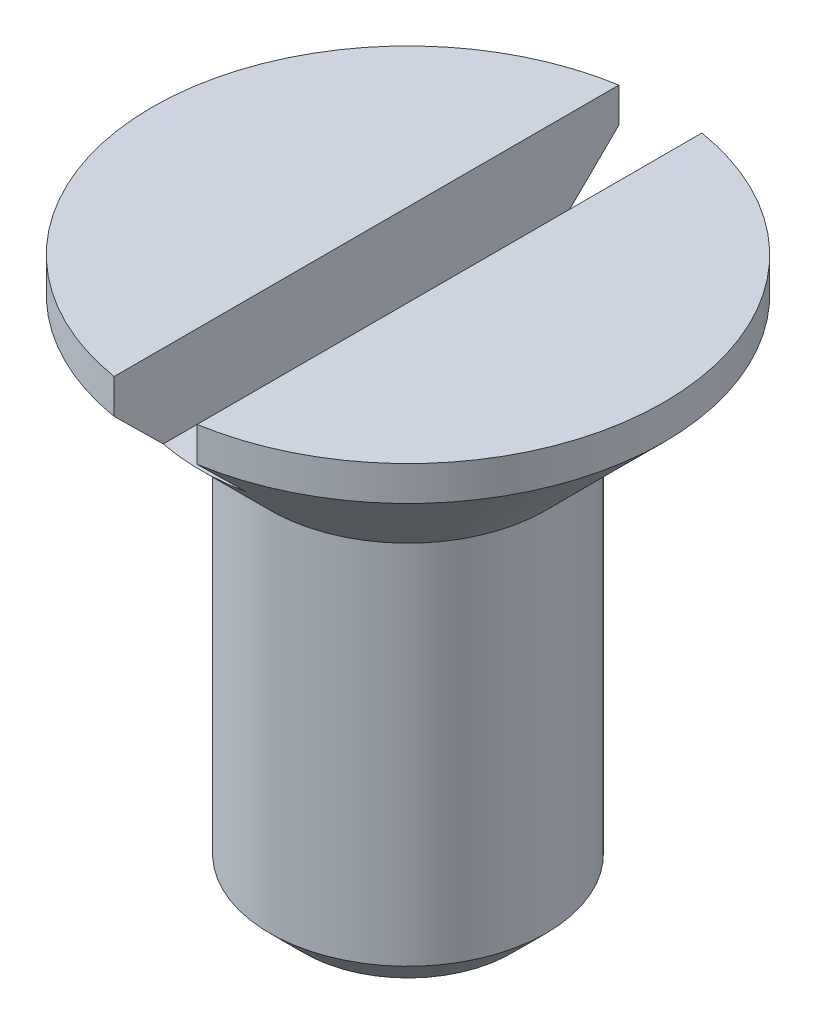
ISO-10303-21;
HEADER;
FILE_DESCRIPTION(('STEP AP214'),'2;1');
FILE_NAME('part.step','',(''),(''),'','','');
FILE_SCHEMA(('AUTOMOTIVE_DESIGN { 1 0 10303 214 1 1 1 1 }'));
ENDSEC;
DATA;
#1=APPLICATION_CONTEXT('core data for automotive mechanical design processes');
#2=APPLICATION_PROTOCOL_DEFINITION('international standard','automotive_design',2000,#1);
#3=PRODUCT_CONTEXT('',#1,'mechanical');
#4=PRODUCT('Part','Part','',(#3));
#5=PRODUCT_RELATED_PRODUCT_CATEGORY('part','',(#4));
#6=PRODUCT_DEFINITION_FORMATION('','',#4);
#7=PRODUCT_DEFINITION_CONTEXT('part definition',#1,'design');
#8=PRODUCT_DEFINITION('design','',#6,#7);
#9=PRODUCT_DEFINITION_SHAPE('','',#8);
#10=(LENGTH_UNIT() NAMED_UNIT(*) SI_UNIT(.MILLI.,.METRE.));
#11=(NAMED_UNIT(*) PLANE_ANGLE_UNIT() SI_UNIT($,.RADIAN.));
#12=(NAMED_UNIT(*) SI_UNIT($,.STERADIAN.) SOLID_ANGLE_UNIT());
#13=UNCERTAINTY_MEASURE_WITH_UNIT(LENGTH_MEASURE(1.E-05),#10,'distance_accuracy_value','');
#14=(GEOMETRIC_REPRESENTATION_CONTEXT(3) GLOBAL_UNCERTAINTY_ASSIGNED_CONTEXT((#13)) GLOBAL_UNIT_ASSIGNED_CONTEXT((#10,
#11,#12)) REPRESENTATION_CONTEXT('',''));
#15=CARTESIAN_POINT('',(0.,0.,0.));
#16=DIRECTION('',(0.,0.,1.));
#17=DIRECTION('',(1.,0.,0.));
#18=AXIS2_PLACEMENT_3D('',#15,#16,#17);
#19=CARTESIAN_POINT('',(-3.7,8.,0.));
#20=DIRECTION('',(0.,1.,0.));
#21=DIRECTION('',(-1.,0.,0.));
#22=AXIS2_PLACEMENT_3D('',#19,#20,#21);
#23=PLANE('',#22);
#24=DIRECTION('',(0.,0.,1.));
#25=VECTOR('',#24,1.);
#26=CARTESIAN_POINT('',(-0.6,8.,-3.7));
#27=LINE('',#26,#25);
#28=CARTESIAN_POINT('',(-0.6,8.,-3.65102725270574));
#29=VERTEX_POINT('',#28);
#30=CARTESIAN_POINT('',(-0.6,8.,3.65102725270574));
#31=VERTEX_POINT('',#30);
#32=EDGE_CURVE('E135',#29,#31,#27,.T.);
#33=ORIENTED_EDGE('',*,*,#32,.F.);
#34=CARTESIAN_POINT('',(0.,8.,0.));
#35=DIRECTION('',(0.,1.,0.));
#36=DIRECTION('',(-1.,0.,0.));
#37=AXIS2_PLACEMENT_3D('',#34,#35,#36);
#38=CIRCLE('',#37,3.7);
#39=EDGE_CURVE('E112',#29,#31,#38,.T.);
#40=ORIENTED_EDGE('',*,*,#39,.T.);
#41=EDGE_LOOP('',(#33,#40));
#42=FACE_BOUND('',#41,.T.);
#43=ADVANCED_FACE('F28',(#42),#23,.T.);
#44=CARTESIAN_POINT('',(0.,8.,0.));
#45=DIRECTION('',(0.,1.,0.));
#46=DIRECTION('',(-1.,0.,0.));
#47=AXIS2_PLACEMENT_3D('',#44,#45,#46);
#48=CYLINDRICAL_SURFACE('',#47,3.7);
#49=DIRECTION('',(0.,1.,0.));
#50=VECTOR('',#49,1.);
#51=CARTESIAN_POINT('',(-0.6,8.,3.65102725270574));
#52=LINE('',#51,#50);
#53=CARTESIAN_POINT('',(-0.6,7.50000000000002,3.65102725270574));
#54=VERTEX_POINT('',#53);
#55=EDGE_CURVE('E56',#31,#54,#52,.F.);
#56=ORIENTED_EDGE('',*,*,#55,.F.);
#57=ORIENTED_EDGE('',*,*,#39,.F.);
#58=DIRECTION('',(0.,1.,0.));
#59=VECTOR('',#58,1.);
#60=CARTESIAN_POINT('',(-0.6,8.,-3.65102725270574));
#61=LINE('',#60,#59);
#62=CARTESIAN_POINT('',(-0.6,7.50000000000002,-3.65102725270574));
#63=VERTEX_POINT('',#62);
#64=EDGE_CURVE('E129',#63,#29,#61,.T.);
#65=ORIENTED_EDGE('',*,*,#64,.F.);
#66=CARTESIAN_POINT('',(0.,7.50000000000002,0.));
#67=DIRECTION('',(0.,1.,0.));
#68=DIRECTION('',(-1.,0.,0.));
#69=AXIS2_PLACEMENT_3D('',#66,#67,#68);
#70=CIRCLE('',#69,3.7);
#71=EDGE_CURVE('E116',#63,#54,#70,.T.);
#72=ORIENTED_EDGE('',*,*,#71,.T.);
#73=EDGE_LOOP('',(#56,#57,#65,#72));
#74=FACE_BOUND('',#73,.T.);
#75=ADVANCED_FACE('F145',(#74),#48,.T.);
#76=DIRECTION('',(0.,0.,1.));
#77=VECTOR('',#76,1.);
#78=CARTESIAN_POINT('',(0.6,8.,-3.7));
#79=LINE('',#78,#77);
#80=CARTESIAN_POINT('',(0.6,8.,-3.65102725270574));
#81=VERTEX_POINT('',#80);
#82=CARTESIAN_POINT('',(0.6,8.,3.65102725270574));
#83=VERTEX_POINT('',#82);
#84=EDGE_CURVE('E99',#81,#83,#79,.T.);
#85=ORIENTED_EDGE('',*,*,#84,.T.);
#86=EDGE_CURVE('E110',#83,#81,#38,.T.);
#87=ORIENTED_EDGE('',*,*,#86,.T.);
#88=EDGE_LOOP('',(#85,#87));
#89=FACE_BOUND('',#88,.T.);
#90=ADVANCED_FACE('F30',(#89),#23,.T.);
#91=DIRECTION('',(0.,1.,0.));
#92=VECTOR('',#91,1.);
#93=CARTESIAN_POINT('',(0.6,8.,-3.65102725270574));
#94=LINE('',#93,#92);
#95=CARTESIAN_POINT('',(0.6,7.50000000000002,-3.65102725270574));
#96=VERTEX_POINT('',#95);
#97=EDGE_CURVE('E131',#81,#96,#94,.F.);
#98=ORIENTED_EDGE('',*,*,#97,.F.);
#99=ORIENTED_EDGE('',*,*,#86,.F.);
#100=DIRECTION('',(0.,1.,0.));
#101=VECTOR('',#100,1.);
#102=CARTESIAN_POINT('',(0.6,8.,3.65102725270574));
#103=LINE('',#102,#101);
#104=CARTESIAN_POINT('',(0.6,7.50000000000002,3.65102725270574));
#105=VERTEX_POINT('',#104);
#106=EDGE_CURVE('E133',#105,#83,#103,.T.);
#107=ORIENTED_EDGE('',*,*,#106,.F.);
#108=EDGE_CURVE('E105',#105,#96,#70,.T.);
#109=ORIENTED_EDGE('',*,*,#108,.T.);
#110=EDGE_LOOP('',(#98,#99,#107,#109));
#111=FACE_BOUND('',#110,.T.);
#112=ADVANCED_FACE('F152',(#111),#48,.T.);
#113=CARTESIAN_POINT('',(0.,7.50000000000002,0.));
#114=DIRECTION('',(0.,1.,0.));
#115=DIRECTION('',(-1.,0.,0.));
#116=AXIS2_PLACEMENT_3D('',#113,#114,#115);
#117=CONICAL_SURFACE('',#116,3.7,0.785398163397443);
#118=CARTESIAN_POINT('',(-0.6,11.9600206241956,8.13793196010485));
#119=CARTESIAN_POINT('',(-0.6,11.6768912812845,7.85402777231896));
#120=CARTESIAN_POINT('',(-0.6,11.3937960861909,7.57008950002176));
#121=CARTESIAN_POINT('',(-0.6,10.8277099701474,7.00209082271698));
#122=CARTESIAN_POINT('',(-0.6,10.5447190528461,6.71803041407335));
#123=CARTESIAN_POINT('',(-0.6,9.97868260725446,6.14953775036886));
#124=CARTESIAN_POINT('',(-0.6,9.69563719837715,5.865105376384));
#125=CARTESIAN_POINT('',(-0.6,9.12979934399216,5.29600682483285));
#126=CARTESIAN_POINT('',(-0.6,8.84700689083491,5.011340654873));
#127=CARTESIAN_POINT('',(-0.6,8.28573332583054,4.44556875001047));
#128=CARTESIAN_POINT('',(-0.6,8.0072468080645,4.16446838236596));
#129=CARTESIAN_POINT('',(-0.6,7.59002402076898,3.74228982182657));
#130=CARTESIAN_POINT('',(-0.6,7.45102756858926,3.60146883259403));
#131=CARTESIAN_POINT('',(-0.6,7.17328458074779,3.31958319518965));
#132=CARTESIAN_POINT('',(-0.6,7.03453804271779,3.17851854935183));
#133=CARTESIAN_POINT('',(-0.6,6.7574716483417,2.89609946410978));
#134=CARTESIAN_POINT('',(-0.6,6.61915162325729,2.75474519043095));
#135=CARTESIAN_POINT('',(-0.6,6.34307152650493,2.47148070482768));
#136=CARTESIAN_POINT('',(-0.6,6.20531147549013,2.32957047277055));
#137=CARTESIAN_POINT('',(-0.6,5.93074167412053,2.04487556787213));
#138=CARTESIAN_POINT('',(-0.6,5.79393176803235,1.9020910459126));
#139=CARTESIAN_POINT('',(-0.6,5.59005283805898,1.68665676476746));
#140=CARTESIAN_POINT('',(-0.6,5.52231783944741,1.61463791010643));
#141=CARTESIAN_POINT('',(-0.6,5.38750438125967,1.4699889932015));
#142=CARTESIAN_POINT('',(-0.6,5.3204259074044,1.39735894431496));
#143=CARTESIAN_POINT('',(-0.6,5.21737067452687,1.28421539613837));
#144=CARTESIAN_POINT('',(-0.6,5.18104052020518,1.24402402952271));
#145=CARTESIAN_POINT('',(-0.6,5.10877701321241,1.16328117926467));
#146=CARTESIAN_POINT('',(-0.6,5.07284368408855,1.12272967450692));
#147=CARTESIAN_POINT('',(-0.6,5.0013920679676,1.04102691374381));
#148=CARTESIAN_POINT('',(-0.6,4.96587552547039,0.99987412858094));
#149=CARTESIAN_POINT('',(-0.6,4.89558487643355,0.916946976871493));
#150=CARTESIAN_POINT('',(-0.6,4.86081066138162,0.875172702709308));
#151=CARTESIAN_POINT('',(-0.6,4.79510737046944,0.794199307952508));
#152=CARTESIAN_POINT('',(-0.6,4.76409575648193,0.755067466057448));
#153=CARTESIAN_POINT('',(-0.6,4.70336797523996,0.675813657835008));
#154=CARTESIAN_POINT('',(-0.6,4.67365157281672,0.635691873338648));
#155=CARTESIAN_POINT('',(-0.6,4.61622665647741,0.554135181970051));
#156=CARTESIAN_POINT('',(-0.6,4.58851442849082,0.512702919788467));
#157=CARTESIAN_POINT('',(-0.6,4.53621522205618,0.42793542507467));
#158=CARTESIAN_POINT('',(-0.6,4.51162392023787,0.384602939456319));
#159=CARTESIAN_POINT('',(-0.6,4.47077124344621,0.301726491885901));
#160=CARTESIAN_POINT('',(-0.6,4.45382070718996,0.262532602955207));
#161=CARTESIAN_POINT('',(-0.6,4.42590828603837,0.182109312015812));
#162=CARTESIAN_POINT('',(-0.6,4.41492295078954,0.140888585704839));
#163=CARTESIAN_POINT('',(-0.6,4.402410068702,0.0639247858075778));
#164=CARTESIAN_POINT('',(-0.6,4.39962349148701,0.0283967599025282));
#165=CARTESIAN_POINT('',(-0.6,4.40046012470945,-0.0425631065150474));
#166=CARTESIAN_POINT('',(-0.6,4.40408119868653,-0.077994975143782));
#167=CARTESIAN_POINT('',(-0.6,4.4191108613007,-0.159349986954465));
#168=CARTESIAN_POINT('',(-0.6,4.43270391393231,-0.204855293705314));
#169=CARTESIAN_POINT('',(-0.6,4.4581067891676,-0.271162915462734));
#170=CARTESIAN_POINT('',(-0.6,4.46744883758506,-0.293008638455442));
#171=CARTESIAN_POINT('',(-0.6,4.48745397120612,-0.336087239478985));
#172=CARTESIAN_POINT('',(-0.6,4.49811672299072,-0.357320270525163));
#173=CARTESIAN_POINT('',(-0.6,4.52939555581037,-0.415982831640739));
#174=CARTESIAN_POINT('',(-0.6,4.55115624380446,-0.452795694277315));
#175=CARTESIAN_POINT('',(-0.6,4.59682208128606,-0.525077964984184));
#176=CARTESIAN_POINT('',(-0.6,4.62072901479264,-0.560546219893626));
#177=CARTESIAN_POINT('',(-0.6,4.67004195715454,-0.630548437000616));
#178=CARTESIAN_POINT('',(-0.6,4.69545152537907,-0.665079873092603));
#179=CARTESIAN_POINT('',(-0.6,4.74728510442057,-0.733375806005275));
#180=CARTESIAN_POINT('',(-0.6,4.77370928127676,-0.767140175845283));
#181=CARTESIAN_POINT('',(-0.6,4.85434134965783,-0.86791924414059));
#182=CARTESIAN_POINT('',(-0.6,4.90964257975871,-0.934056109051676));
#183=CARTESIAN_POINT('',(-0.6,5.02176654130162,-1.06481071116444));
#184=CARTESIAN_POINT('',(-0.6,5.07858650349831,-1.12943085704488));
#185=CARTESIAN_POINT('',(-0.6,5.19241187106198,-1.25682824367005));
#186=CARTESIAN_POINT('',(-0.6,5.24940259970984,-1.31961861941936));
#187=CARTESIAN_POINT('',(-0.6,5.36404478846877,-1.44459287058122));
#188=CARTESIAN_POINT('',(-0.6,5.42169625897604,-1.50677673642228));
#189=CARTESIAN_POINT('',(-0.6,5.59534223900285,-1.69270278432733));
#190=CARTESIAN_POINT('',(-0.6,5.71201793375946,-1.81580796723869));
#191=CARTESIAN_POINT('',(-0.6,5.94644280759327,-2.0611887484764));
#192=CARTESIAN_POINT('',(-0.6,6.06419282008438,-2.18346354647024));
#193=CARTESIAN_POINT('',(-0.6,6.30028890308813,-2.42742423040908));
#194=CARTESIAN_POINT('',(-0.6,6.41863494334992,-2.5491101456397));
#195=CARTESIAN_POINT('',(-0.6,6.65500717812537,-2.79137280615527));
#196=CARTESIAN_POINT('',(-0.6,6.77303104136325,-2.91195182898463));
#197=CARTESIAN_POINT('',(-0.6,7.00934781550322,-3.15284893689327));
#198=CARTESIAN_POINT('',(-0.6,7.127640729892,-3.27316701855105));
#199=CARTESIAN_POINT('',(-0.6,7.48272713697432,-3.63376526150934));
#200=CARTESIAN_POINT('',(-0.6,7.7198037469924,-3.87376652863277));
#201=CARTESIAN_POINT('',(-0.6,8.28863195924055,-4.44861133790147));
#202=CARTESIAN_POINT('',(-0.6,8.62058203399428,-4.78325830289931));
#203=CARTESIAN_POINT('',(-0.6,9.28494781383582,-5.45216769917099));
#204=CARTESIAN_POINT('',(-0.6,9.61736356911085,-5.78643008057179));
#205=CARTESIAN_POINT('',(-0.6,10.2847457930006,-6.45701285565821));
#206=CARTESIAN_POINT('',(-0.6,10.6197140122828,-6.79333150662994));
#207=CARTESIAN_POINT('',(-0.6,11.2897808105559,-7.46575829971184));
#208=CARTESIAN_POINT('',(-0.6,11.6248793690147,-7.80186646228028));
#209=CARTESIAN_POINT('',(-0.6,11.9600206241956,-8.13793196010485));
#210=B_SPLINE_CURVE_WITH_KNOTS('',3,(#118,#119,#120,#121,#122,#123,#124,#125,#126,#127,#128,
#129,#130,#131,#132,#133,#134,#135,#136,#137,#138,#139,#140,#141,#142,#143,#144,#145,#146,#147,
#148,#149,#150,#151,#152,#153,#154,#155,#156,#157,#158,#159,#160,#161,#162,#163,#164,#165,#166,
#167,#168,#169,#170,#171,#172,#173,#174,#175,#176,#177,#178,#179,#180,#181,#182,#183,#184,#185,
#186,#187,#188,#189,#190,#191,#192,#193,#194,#195,#196,#197,#198,#199,#200,#201,#202,#203,#204,
#205,#206,#207,#208,#209),.UNSPECIFIED.,.F.,.F.,(4,2,2,2,2,2,2,2,2,2,2,2,2,2,2,2,2,2,2,2,2,2,2,
2,2,2,2,2,2,2,2,2,2,2,2,2,2,2,2,2,2,2,2,2,2,4),(0.,1.20286091475452,2.40576053584868,
3.60956618842961,4.81333411531859,6.00040930817249,6.59400413473686,7.18759330634946,
7.78090579697013,8.3742399753186,8.96747449255334,9.26407415171825,9.5606673455807,
9.72319861560583,9.88573947880689,10.0488126207255,10.2118617593269,10.3616347814149,
10.5113804952798,10.6608411897885,10.8100925247216,10.9379019301194,11.0652051861339,
11.1715563779878,11.2778721165554,11.4194479223042,11.4907036241509,11.5619413736212,
11.6901080531411,11.8183822726337,11.9469735623142,12.075585986218,12.3341618029343,
12.5922945826552,12.8466786122314,13.1010666498339,13.6098890890932,14.1191470825747,
14.6283794844877,15.1345611743107,15.6407494616195,16.6528023877671,18.0668791450929,
19.4811222704145,20.9051395740233,22.3289855542461),.UNSPECIFIED.);
#211=CARTESIAN_POINT('',(-0.6,6.8,2.9393876913398));
#212=VERTEX_POINT('',#211);
#213=EDGE_CURVE('E11',#54,#212,#210,.T.);
#214=ORIENTED_EDGE('',*,*,#213,.F.);
#215=ORIENTED_EDGE('',*,*,#71,.F.);
#216=CARTESIAN_POINT('',(-0.6,6.8,-2.9393876913398));
#217=VERTEX_POINT('',#216);
#218=EDGE_CURVE('E32',#217,#63,#210,.T.);
#219=ORIENTED_EDGE('',*,*,#218,.F.);
#220=CARTESIAN_POINT('',(0.,6.8,0.));
#221=DIRECTION('',(0.,-1.,0.));
#222=DIRECTION('',(0.,0.,-1.));
#223=AXIS2_PLACEMENT_3D('',#220,#221,#222);
#224=CIRCLE('',#223,2.99999999999999);
#225=CARTESIAN_POINT('',(0.6,6.8,-2.9393876913398));
#226=VERTEX_POINT('',#225);
#227=EDGE_CURVE('E92',#226,#217,#224,.F.);
#228=ORIENTED_EDGE('',*,*,#227,.F.);
#229=CARTESIAN_POINT('',(0.6,11.9600206241956,-8.13793196010485));
#230=CARTESIAN_POINT('',(0.6,11.6768912812845,-7.85402777231896));
#231=CARTESIAN_POINT('',(0.6,11.3937960861909,-7.57008950002176));
#232=CARTESIAN_POINT('',(0.6,10.8277099701474,-7.00209082271698));
#233=CARTESIAN_POINT('',(0.6,10.5447190528461,-6.71803041407335));
#234=CARTESIAN_POINT('',(0.6,9.97868260725446,-6.14953775036886));
#235=CARTESIAN_POINT('',(0.6,9.69563719837715,-5.865105376384));
#236=CARTESIAN_POINT('',(0.6,9.12979934399216,-5.29600682483285));
#237=CARTESIAN_POINT('',(0.6,8.84700689083492,-5.011340654873));
#238=CARTESIAN_POINT('',(0.6,8.28573332583054,-4.44556875001047));
#239=CARTESIAN_POINT('',(0.6,8.0072468080645,-4.16446838236596));
#240=CARTESIAN_POINT('',(0.6,7.59002402076898,-3.74228982182657));
#241=CARTESIAN_POINT('',(0.6,7.45102756858926,-3.60146883259403));
#242=CARTESIAN_POINT('',(0.6,7.17328458074779,-3.31958319518965));
#243=CARTESIAN_POINT('',(0.6,7.0345380427178,-3.17851854935183));
#244=CARTESIAN_POINT('',(0.6,6.7574716483417,-2.89609946410978));
#245=CARTESIAN_POINT('',(0.6,6.6191516232573,-2.75474519043096));
#246=CARTESIAN_POINT('',(0.6,6.34307152650493,-2.47148070482769));
#247=CARTESIAN_POINT('',(0.6,6.20531147549013,-2.32957047277055));
#248=CARTESIAN_POINT('',(0.6,5.93074167412053,-2.04487556787213));
#249=CARTESIAN_POINT('',(0.6,5.79393176803235,-1.90209104591261));
#250=CARTESIAN_POINT('',(0.6,5.59005283805898,-1.68665676476746));
#251=CARTESIAN_POINT('',(0.6,5.52231783944741,-1.61463791010643));
#252=CARTESIAN_POINT('',(0.6,5.38750438125967,-1.4699889932015));
#253=CARTESIAN_POINT('',(0.6,5.3204259074044,-1.39735894431496));
#254=CARTESIAN_POINT('',(0.6,5.21737067452687,-1.28421539613837));
#255=CARTESIAN_POINT('',(0.6,5.18104052020518,-1.24402402952271));
#256=CARTESIAN_POINT('',(0.6,5.10877701321241,-1.16328117926467));
#257=CARTESIAN_POINT('',(0.6,5.07284368408855,-1.12272967450692));
#258=CARTESIAN_POINT('',(0.6,5.0013920679676,-1.04102691374381));
#259=CARTESIAN_POINT('',(0.6,4.96587552547039,-0.99987412858094));
#260=CARTESIAN_POINT('',(0.6,4.89558487643354,-0.916946976871492));
#261=CARTESIAN_POINT('',(0.6,4.86081066138162,-0.875172702709307));
#262=CARTESIAN_POINT('',(0.6,4.79510737046944,-0.794199307952508));
#263=CARTESIAN_POINT('',(0.6,4.76409575648194,-0.755067466057448));
#264=CARTESIAN_POINT('',(0.6,4.70336797523996,-0.675813657835008));
#265=CARTESIAN_POINT('',(0.6,4.67365157281672,-0.635691873338648));
#266=CARTESIAN_POINT('',(0.6,4.61622665647741,-0.55413518197005));
#267=CARTESIAN_POINT('',(0.6,4.58851442849082,-0.512702919788466));
#268=CARTESIAN_POINT('',(0.6,4.53621522205618,-0.427935425074669));
#269=CARTESIAN_POINT('',(0.6,4.51162392023787,-0.384602939456318));
#270=CARTESIAN_POINT('',(0.6,4.47077124344621,-0.301726491885899));
#271=CARTESIAN_POINT('',(0.6,4.45382070718996,-0.262532602955205));
#272=CARTESIAN_POINT('',(0.6,4.42590828603837,-0.182109312015811));
#273=CARTESIAN_POINT('',(0.6,4.41492295078953,-0.140888585704838));
#274=CARTESIAN_POINT('',(0.6,4.402410068702,-0.0639247858075761));
#275=CARTESIAN_POINT('',(0.6,4.39962349148702,-0.0283967599025265));
#276=CARTESIAN_POINT('',(0.6,4.40046012470945,0.0425631065150492));
#277=CARTESIAN_POINT('',(0.6,4.40408119868653,0.0779949751437839));
#278=CARTESIAN_POINT('',(0.6,4.4191108613007,0.159349986954467));
#279=CARTESIAN_POINT('',(0.6,4.43270391393231,0.204855293705315));
#280=CARTESIAN_POINT('',(0.6,4.4581067891676,0.271162915462735));
#281=CARTESIAN_POINT('',(0.6,4.46744883758506,0.293008638455444));
#282=CARTESIAN_POINT('',(0.6,4.48745397120612,0.336087239478987));
#283=CARTESIAN_POINT('',(0.6,4.49811672299072,0.357320270525166));
#284=CARTESIAN_POINT('',(0.6,4.52939555581038,0.415982831640743));
#285=CARTESIAN_POINT('',(0.6,4.55115624380447,0.452795694277319));
#286=CARTESIAN_POINT('',(0.6,4.59682208128606,0.525077964984188));
#287=CARTESIAN_POINT('',(0.6,4.62072901479265,0.560546219893631));
#288=CARTESIAN_POINT('',(0.6,4.67004195715455,0.630548437000622));
#289=CARTESIAN_POINT('',(0.6,4.69545152537907,0.665079873092609));
#290=CARTESIAN_POINT('',(0.6,4.74728510442057,0.733375806005282));
#291=CARTESIAN_POINT('',(0.6,4.77370928127676,0.76714017584529));
#292=CARTESIAN_POINT('',(0.6,4.85434134965784,0.867919244140597));
#293=CARTESIAN_POINT('',(0.6,4.90964257975871,0.934056109051684));
#294=CARTESIAN_POINT('',(0.6,5.02176654130163,1.06481071116444));
#295=CARTESIAN_POINT('',(0.6,5.07858650349831,1.12943085704489));
#296=CARTESIAN_POINT('',(0.6,5.19241187106199,1.25682824367006));
#297=CARTESIAN_POINT('',(0.6,5.24940259970985,1.31961861941937));
#298=CARTESIAN_POINT('',(0.6,5.36404478846878,1.44459287058123));
#299=CARTESIAN_POINT('',(0.6,5.42169625897605,1.5067767364223));
#300=CARTESIAN_POINT('',(0.6,5.59534223900287,1.69270278432735));
#301=CARTESIAN_POINT('',(0.6,5.71201793375947,1.8158079672387));
#302=CARTESIAN_POINT('',(0.6,5.94644280759329,2.06118874847642));
#303=CARTESIAN_POINT('',(0.6,6.0641928200844,2.18346354647026));
#304=CARTESIAN_POINT('',(0.6,6.30028890308816,2.4274242304091));
#305=CARTESIAN_POINT('',(0.6,6.41863494334994,2.54911014563972));
#306=CARTESIAN_POINT('',(0.6,6.6550071781254,2.7913728061553));
#307=CARTESIAN_POINT('',(0.6,6.77303104136328,2.91195182898466));
#308=CARTESIAN_POINT('',(0.6,7.00934781550326,3.1528489368933));
#309=CARTESIAN_POINT('',(0.6,7.12764072989203,3.27316701855108));
#310=CARTESIAN_POINT('',(0.6,7.48272713697436,3.63376526150937));
#311=CARTESIAN_POINT('',(0.6,7.71980374699244,3.87376652863281));
#312=CARTESIAN_POINT('',(0.6,8.2886319592406,4.44861133790151));
#313=CARTESIAN_POINT('',(0.6,8.62058203399432,4.78325830289935));
#314=CARTESIAN_POINT('',(0.6,9.28494781383584,5.45216769917102));
#315=CARTESIAN_POINT('',(0.6,9.61736356911087,5.78643008057182));
#316=CARTESIAN_POINT('',(0.6,10.2847457930006,6.45701285565822));
#317=CARTESIAN_POINT('',(0.6,10.6197140122828,6.79333150662996));
#318=CARTESIAN_POINT('',(0.6,11.2897808105559,7.46575829971185));
#319=CARTESIAN_POINT('',(0.6,11.6248793690147,7.80186646228028));
#320=CARTESIAN_POINT('',(0.6,11.9600206241956,8.13793196010485));
#321=B_SPLINE_CURVE_WITH_KNOTS('',3,(#229,#230,#231,#232,#233,#234,#235,#236,#237,#238,#239,
#240,#241,#242,#243,#244,#245,#246,#247,#248,#249,#250,#251,#252,#253,#254,#255,#256,#257,#258,
#259,#260,#261,#262,#263,#264,#265,#266,#267,#268,#269,#270,#271,#272,#273,#274,#275,#276,#277,
#278,#279,#280,#281,#282,#283,#284,#285,#286,#287,#288,#289,#290,#291,#292,#293,#294,#295,#296,
#297,#298,#299,#300,#301,#302,#303,#304,#305,#306,#307,#308,#309,#310,#311,#312,#313,#314,#315,
#316,#317,#318,#319,#320),.UNSPECIFIED.,.F.,.F.,(4,2,2,2,2,2,2,2,2,2,2,2,2,2,2,2,2,2,2,2,2,2,2,
2,2,2,2,2,2,2,2,2,2,2,2,2,2,2,2,2,2,2,2,2,2,4),(0.,1.20286091475452,2.40576053584867,
3.6095661884296,4.81333411531858,6.00040930817249,6.59400413473686,7.18759330634946,
7.78090579697012,8.37423997531859,8.96747449255333,9.26407415171824,9.5606673455807,
9.72319861560583,9.88573947880689,10.0488126207255,10.2118617593269,10.3616347814149,
10.5113804952798,10.6608411897885,10.8100925247216,10.9379019301194,11.0652051861339,
11.1715563779878,11.2778721165554,11.4194479223042,11.490703624151,11.5619413736212,
11.6901080531411,11.8183822726337,11.9469735623142,12.075585986218,12.3341618029343,
12.5922945826552,12.8466786122314,13.1010666498339,13.6098890890932,14.1191470825748,
14.6283794844878,15.1345611743107,15.6407494616195,16.6528023877672,18.066879145093,
19.4811222704145,20.9051395740233,22.3289855542461),.UNSPECIFIED.);
#322=EDGE_CURVE('E97',#96,#226,#321,.T.);
#323=ORIENTED_EDGE('',*,*,#322,.F.);
#324=ORIENTED_EDGE('',*,*,#108,.F.);
#325=CARTESIAN_POINT('',(0.6,6.8,2.9393876913398));
#326=VERTEX_POINT('',#325);
#327=EDGE_CURVE('E42',#326,#105,#321,.T.);
#328=ORIENTED_EDGE('',*,*,#327,.F.);
#329=EDGE_CURVE('E85',#212,#326,#224,.F.);
#330=ORIENTED_EDGE('',*,*,#329,.F.);
#331=EDGE_LOOP('',(#214,#215,#219,#228,#323,#324,#328,#330));
#332=FACE_BOUND('',#331,.T.);
#333=CARTESIAN_POINT('',(0.,5.8,0.));
#334=DIRECTION('',(0.,1.,0.));
#335=DIRECTION('',(-1.,0.,0.));
#336=AXIS2_PLACEMENT_3D('',#333,#334,#335);
#337=CIRCLE('',#336,2.);
#338=CARTESIAN_POINT('',(-2.,5.8,0.));
#339=VERTEX_POINT('',#338);
#340=EDGE_CURVE('E119',#339,#339,#337,.T.);
#341=ORIENTED_EDGE('',*,*,#340,.T.);
#342=EDGE_LOOP('',(#341));
#343=FACE_BOUND('',#342,.T.);
#344=ADVANCED_FACE('F102',(#332,#343),#117,.T.);
#345=CARTESIAN_POINT('',(0.,8.,0.));
#346=DIRECTION('',(0.,1.,0.));
#347=DIRECTION('',(-1.,0.,0.));
#348=AXIS2_PLACEMENT_3D('',#345,#346,#347);
#349=CYLINDRICAL_SURFACE('',#348,2.);
#350=CARTESIAN_POINT('',(0.,0.499999999999997,0.));
#351=DIRECTION('',(0.,1.,0.));
#352=DIRECTION('',(-1.,0.,0.));
#353=AXIS2_PLACEMENT_3D('',#350,#351,#352);
#354=CIRCLE('',#353,2.);
#355=CARTESIAN_POINT('',(-2.,0.499999999999997,0.));
#356=VERTEX_POINT('',#355);
#357=EDGE_CURVE('E122',#356,#356,#354,.T.);
#358=ORIENTED_EDGE('',*,*,#357,.T.);
#359=EDGE_LOOP('',(#358));
#360=FACE_BOUND('',#359,.T.);
#361=ORIENTED_EDGE('',*,*,#340,.F.);
#362=EDGE_LOOP('',(#361));
#363=FACE_BOUND('',#362,.T.);
#364=ADVANCED_FACE('F165',(#360,#363),#349,.T.);
#365=CARTESIAN_POINT('',(0.,0.499999999999997,0.));
#366=DIRECTION('',(0.,1.,0.));
#367=DIRECTION('',(-1.,0.,0.));
#368=AXIS2_PLACEMENT_3D('',#365,#366,#367);
#369=CONICAL_SURFACE('',#368,2.,0.78539816339745);
#370=CARTESIAN_POINT('',(0.,0.,0.));
#371=DIRECTION('',(0.,1.,0.));
#372=DIRECTION('',(-1.,0.,0.));
#373=AXIS2_PLACEMENT_3D('',#370,#371,#372);
#374=CIRCLE('',#373,1.5);
#375=CARTESIAN_POINT('',(-1.5,0.,0.));
#376=VERTEX_POINT('',#375);
#377=EDGE_CURVE('E125',#376,#376,#374,.T.);
#378=ORIENTED_EDGE('',*,*,#377,.T.);
#379=EDGE_LOOP('',(#378));
#380=FACE_BOUND('',#379,.T.);
#381=ORIENTED_EDGE('',*,*,#357,.F.);
#382=EDGE_LOOP('',(#381));
#383=FACE_BOUND('',#382,.T.);
#384=ADVANCED_FACE('F171',(#380,#383),#369,.T.);
#385=CARTESIAN_POINT('',(0.,0.,0.));
#386=DIRECTION('',(0.,-1.,0.));
#387=DIRECTION('',(1.,0.,0.));
#388=AXIS2_PLACEMENT_3D('',#385,#386,#387);
#389=PLANE('',#388);
#390=ORIENTED_EDGE('',*,*,#377,.F.);
#391=EDGE_LOOP('',(#390));
#392=FACE_BOUND('',#391,.T.);
#393=ADVANCED_FACE('F175',(#392),#389,.T.);
#394=CARTESIAN_POINT('',(-0.6,8.,-3.7));
#395=DIRECTION('',(-1.,0.,0.));
#396=DIRECTION('',(0.,-1.,0.));
#397=AXIS2_PLACEMENT_3D('',#394,#395,#396);
#398=PLANE('',#397);
#399=ORIENTED_EDGE('',*,*,#55,.T.);
#400=ORIENTED_EDGE('',*,*,#213,.T.);
#401=DIRECTION('',(0.,0.,1.));
#402=VECTOR('',#401,1.);
#403=CARTESIAN_POINT('',(-0.6,6.8,-3.7));
#404=LINE('',#403,#402);
#405=EDGE_CURVE('E88',#217,#212,#404,.T.);
#406=ORIENTED_EDGE('',*,*,#405,.F.);
#407=ORIENTED_EDGE('',*,*,#218,.T.);
#408=ORIENTED_EDGE('',*,*,#64,.T.);
#409=ORIENTED_EDGE('',*,*,#32,.T.);
#410=EDGE_LOOP('',(#399,#400,#406,#407,#408,#409));
#411=FACE_BOUND('',#410,.T.);
#412=ADVANCED_FACE('F140',(#411),#398,.F.);
#413=CARTESIAN_POINT('',(0.6,8.,-3.7));
#414=DIRECTION('',(1.,0.,0.));
#415=DIRECTION('',(0.,1.,0.));
#416=AXIS2_PLACEMENT_3D('',#413,#414,#415);
#417=PLANE('',#416);
#418=ORIENTED_EDGE('',*,*,#97,.T.);
#419=ORIENTED_EDGE('',*,*,#322,.T.);
#420=DIRECTION('',(0.,0.,1.));
#421=VECTOR('',#420,1.);
#422=CARTESIAN_POINT('',(0.6,6.8,-3.7));
#423=LINE('',#422,#421);
#424=EDGE_CURVE('E49',#226,#326,#423,.T.);
#425=ORIENTED_EDGE('',*,*,#424,.T.);
#426=ORIENTED_EDGE('',*,*,#327,.T.);
#427=ORIENTED_EDGE('',*,*,#106,.T.);
#428=ORIENTED_EDGE('',*,*,#84,.F.);
#429=EDGE_LOOP('',(#418,#419,#425,#426,#427,#428));
#430=FACE_BOUND('',#429,.T.);
#431=ADVANCED_FACE('F94',(#430),#417,.F.);
#432=CARTESIAN_POINT('',(-0.6,6.8,-3.7));
#433=DIRECTION('',(0.,-1.,0.));
#434=DIRECTION('',(0.,0.,-1.));
#435=AXIS2_PLACEMENT_3D('',#432,#433,#434);
#436=PLANE('',#435);
#437=ORIENTED_EDGE('',*,*,#329,.T.);
#438=ORIENTED_EDGE('',*,*,#424,.F.);
#439=ORIENTED_EDGE('',*,*,#227,.T.);
#440=ORIENTED_EDGE('',*,*,#405,.T.);
#441=EDGE_LOOP('',(#437,#438,#439,#440));
#442=FACE_BOUND('',#441,.T.);
#443=ADVANCED_FACE('F86',(#442),#436,.F.);
#444=CLOSED_SHELL('',(#43,#75,#90,#112,#344,#364,#384,#393,#412,#431,#443));
#445=MANIFOLD_SOLID_BREP('B2',#444);
#446=ADVANCED_BREP_SHAPE_REPRESENTATION('',(#18,#445),#14);
#447=SHAPE_DEFINITION_REPRESENTATION(#9,#446);
ENDSEC;
END-ISO-10303-21;
